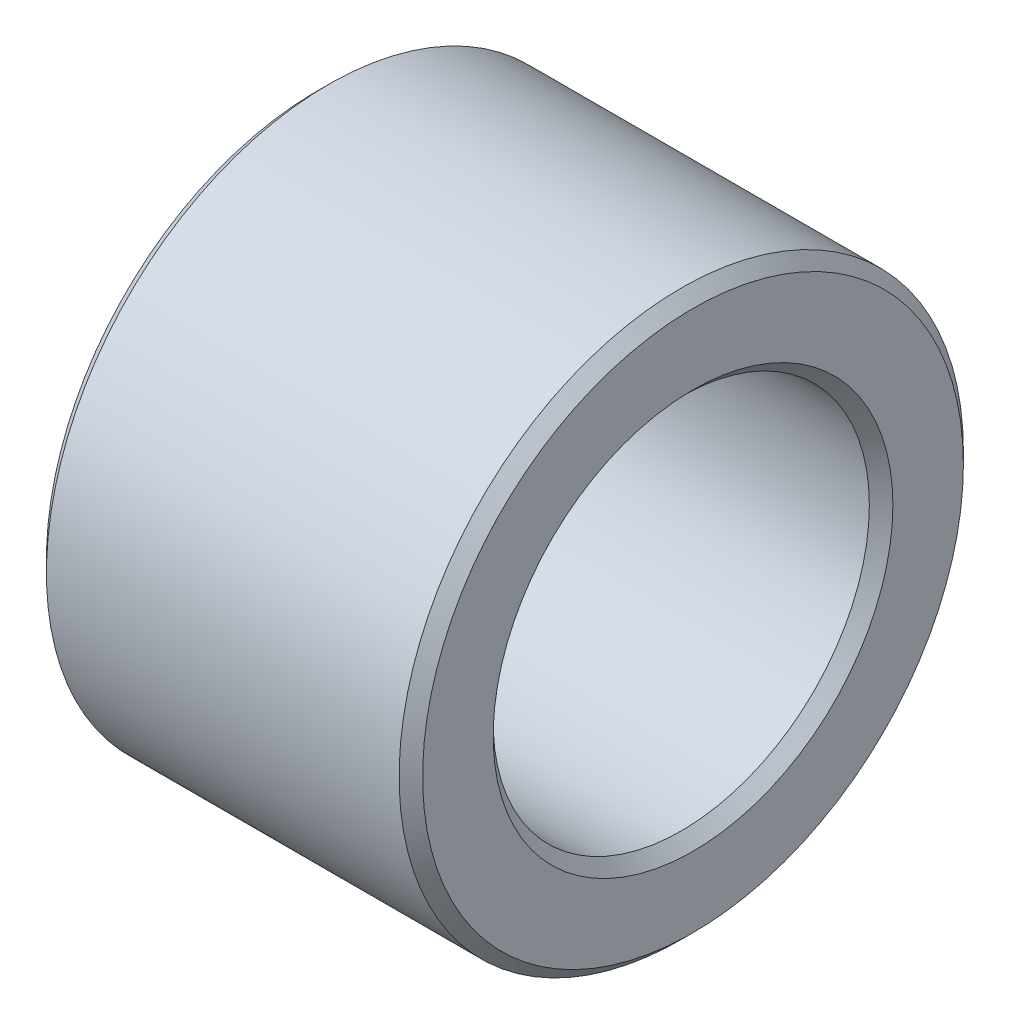
ISO-10303-21;
HEADER;
FILE_DESCRIPTION(('STEP AP214'),'2;1');
FILE_NAME('part.step','',(''),(''),'','','');
FILE_SCHEMA(('AUTOMOTIVE_DESIGN { 1 0 10303 214 1 1 1 1 }'));
ENDSEC;
DATA;
#1=APPLICATION_CONTEXT('core data for automotive mechanical design processes');
#2=APPLICATION_PROTOCOL_DEFINITION('international standard','automotive_design',2000,#1);
#3=PRODUCT_CONTEXT('',#1,'mechanical');
#4=PRODUCT('Part','Part','',(#3));
#5=PRODUCT_RELATED_PRODUCT_CATEGORY('part','',(#4));
#6=PRODUCT_DEFINITION_FORMATION('','',#4);
#7=PRODUCT_DEFINITION_CONTEXT('part definition',#1,'design');
#8=PRODUCT_DEFINITION('design','',#6,#7);
#9=PRODUCT_DEFINITION_SHAPE('','',#8);
#10=(LENGTH_UNIT() NAMED_UNIT(*) SI_UNIT(.MILLI.,.METRE.));
#11=(NAMED_UNIT(*) PLANE_ANGLE_UNIT() SI_UNIT($,.RADIAN.));
#12=(NAMED_UNIT(*) SI_UNIT($,.STERADIAN.) SOLID_ANGLE_UNIT());
#13=UNCERTAINTY_MEASURE_WITH_UNIT(LENGTH_MEASURE(1.E-05),#10,'distance_accuracy_value','');
#14=(GEOMETRIC_REPRESENTATION_CONTEXT(3) GLOBAL_UNCERTAINTY_ASSIGNED_CONTEXT((#13)) GLOBAL_UNIT_ASSIGNED_CONTEXT((#10,
#11,#12)) REPRESENTATION_CONTEXT('',''));
#15=CARTESIAN_POINT('',(0.,0.,0.));
#16=DIRECTION('',(0.,0.,1.));
#17=DIRECTION('',(1.,0.,0.));
#18=AXIS2_PLACEMENT_3D('',#15,#16,#17);
#19=CARTESIAN_POINT('',(8.,0.,0.));
#20=DIRECTION('',(1.,0.,0.));
#21=DIRECTION('',(0.,0.,-1.));
#22=AXIS2_PLACEMENT_3D('',#19,#20,#21);
#23=PLANE('',#22);
#24=CARTESIAN_POINT('',(8.,0.,0.));
#25=DIRECTION('',(1.,0.,0.));
#26=DIRECTION('',(0.,0.,-1.));
#27=AXIS2_PLACEMENT_3D('',#24,#25,#26);
#28=CIRCLE('',#27,5.75);
#29=CARTESIAN_POINT('',(8.,0.,-5.75));
#30=VERTEX_POINT('',#29);
#31=EDGE_CURVE('E10',#30,#30,#28,.T.);
#32=ORIENTED_EDGE('',*,*,#31,.T.);
#33=EDGE_LOOP('',(#32));
#34=FACE_BOUND('',#33,.T.);
#35=CARTESIAN_POINT('',(8.,0.,0.));
#36=DIRECTION('',(1.,0.,0.));
#37=DIRECTION('',(0.,0.,-1.));
#38=AXIS2_PLACEMENT_3D('',#35,#36,#37);
#39=CIRCLE('',#38,4.25);
#40=CARTESIAN_POINT('',(8.,0.,-4.25));
#41=VERTEX_POINT('',#40);
#42=EDGE_CURVE('E35',#41,#41,#39,.F.);
#43=ORIENTED_EDGE('',*,*,#42,.T.);
#44=EDGE_LOOP('',(#43));
#45=FACE_BOUND('',#44,.T.);
#46=ADVANCED_FACE('F28',(#34,#45),#23,.T.);
#47=CARTESIAN_POINT('',(0.,0.,0.));
#48=DIRECTION('',(1.,0.,0.));
#49=DIRECTION('',(0.,0.,-1.));
#50=AXIS2_PLACEMENT_3D('',#47,#48,#49);
#51=PLANE('',#50);
#52=CARTESIAN_POINT('',(0.,0.,0.));
#53=DIRECTION('',(1.,0.,0.));
#54=DIRECTION('',(0.,0.,-1.));
#55=AXIS2_PLACEMENT_3D('',#52,#53,#54);
#56=CIRCLE('',#55,5.75);
#57=CARTESIAN_POINT('',(0.,0.,-5.75));
#58=VERTEX_POINT('',#57);
#59=EDGE_CURVE('E48',#58,#58,#56,.F.);
#60=ORIENTED_EDGE('',*,*,#59,.T.);
#61=EDGE_LOOP('',(#60));
#62=FACE_BOUND('',#61,.T.);
#63=CARTESIAN_POINT('',(0.,0.,0.));
#64=DIRECTION('',(1.,0.,0.));
#65=DIRECTION('',(0.,0.,-1.));
#66=AXIS2_PLACEMENT_3D('',#63,#64,#65);
#67=CIRCLE('',#66,4.25);
#68=CARTESIAN_POINT('',(0.,0.,-4.25));
#69=VERTEX_POINT('',#68);
#70=EDGE_CURVE('E51',#69,#69,#67,.T.);
#71=ORIENTED_EDGE('',*,*,#70,.T.);
#72=EDGE_LOOP('',(#71));
#73=FACE_BOUND('',#72,.T.);
#74=ADVANCED_FACE('F76',(#62,#73),#51,.F.);
#75=CARTESIAN_POINT('',(8.,0.,0.));
#76=DIRECTION('',(-1.,0.,0.));
#77=DIRECTION('',(0.,0.,1.));
#78=AXIS2_PLACEMENT_3D('',#75,#76,#77);
#79=CYLINDRICAL_SURFACE('',#78,6.);
#80=CARTESIAN_POINT('',(0.250000000000001,0.,0.));
#81=DIRECTION('',(1.,0.,0.));
#82=DIRECTION('',(0.,0.,-1.));
#83=AXIS2_PLACEMENT_3D('',#80,#81,#82);
#84=CIRCLE('',#83,6.);
#85=CARTESIAN_POINT('',(0.250000000000001,0.,-6.));
#86=VERTEX_POINT('',#85);
#87=EDGE_CURVE('E54',#86,#86,#84,.T.);
#88=ORIENTED_EDGE('',*,*,#87,.T.);
#89=EDGE_LOOP('',(#88));
#90=FACE_BOUND('',#89,.T.);
#91=CARTESIAN_POINT('',(7.75,0.,0.));
#92=DIRECTION('',(1.,0.,0.));
#93=DIRECTION('',(0.,0.,-1.));
#94=AXIS2_PLACEMENT_3D('',#91,#92,#93);
#95=CIRCLE('',#94,6.);
#96=CARTESIAN_POINT('',(7.75,0.,-6.));
#97=VERTEX_POINT('',#96);
#98=EDGE_CURVE('E57',#97,#97,#95,.F.);
#99=ORIENTED_EDGE('',*,*,#98,.T.);
#100=EDGE_LOOP('',(#99));
#101=FACE_BOUND('',#100,.T.);
#102=ADVANCED_FACE('F61',(#90,#101),#79,.T.);
#103=CARTESIAN_POINT('',(8.,0.,0.));
#104=DIRECTION('',(-1.,0.,0.));
#105=DIRECTION('',(0.,0.,1.));
#106=AXIS2_PLACEMENT_3D('',#103,#104,#105);
#107=CYLINDRICAL_SURFACE('',#106,4.);
#108=CARTESIAN_POINT('',(0.250000000000002,0.,0.));
#109=DIRECTION('',(1.,0.,0.));
#110=DIRECTION('',(0.,0.,-1.));
#111=AXIS2_PLACEMENT_3D('',#108,#109,#110);
#112=CIRCLE('',#111,4.);
#113=CARTESIAN_POINT('',(0.250000000000002,0.,-4.));
#114=VERTEX_POINT('',#113);
#115=EDGE_CURVE('E39',#114,#114,#112,.F.);
#116=ORIENTED_EDGE('',*,*,#115,.T.);
#117=EDGE_LOOP('',(#116));
#118=FACE_BOUND('',#117,.T.);
#119=CARTESIAN_POINT('',(7.75,0.,0.));
#120=DIRECTION('',(1.,0.,0.));
#121=DIRECTION('',(0.,0.,-1.));
#122=AXIS2_PLACEMENT_3D('',#119,#120,#121);
#123=CIRCLE('',#122,4.);
#124=CARTESIAN_POINT('',(7.75,0.,-4.));
#125=VERTEX_POINT('',#124);
#126=EDGE_CURVE('E43',#125,#125,#123,.T.);
#127=ORIENTED_EDGE('',*,*,#126,.T.);
#128=EDGE_LOOP('',(#127));
#129=FACE_BOUND('',#128,.T.);
#130=ADVANCED_FACE('F84',(#118,#129),#107,.F.);
#131=CARTESIAN_POINT('',(0.250000000000001,0.,0.));
#132=DIRECTION('',(1.,0.,0.));
#133=DIRECTION('',(0.,0.,-1.));
#134=AXIS2_PLACEMENT_3D('',#131,#132,#133);
#135=CONICAL_SURFACE('',#134,6.,0.785398163397447);
#136=ORIENTED_EDGE('',*,*,#59,.F.);
#137=EDGE_LOOP('',(#136));
#138=FACE_BOUND('',#137,.T.);
#139=ORIENTED_EDGE('',*,*,#87,.F.);
#140=EDGE_LOOP('',(#139));
#141=FACE_BOUND('',#140,.T.);
#142=ADVANCED_FACE('F72',(#138,#141),#135,.T.);
#143=CARTESIAN_POINT('',(0.,0.,0.));
#144=DIRECTION('',(-1.,0.,0.));
#145=DIRECTION('',(0.,0.,1.));
#146=AXIS2_PLACEMENT_3D('',#143,#144,#145);
#147=CONICAL_SURFACE('',#146,4.25,0.785398163397445);
#148=ORIENTED_EDGE('',*,*,#115,.F.);
#149=EDGE_LOOP('',(#148));
#150=FACE_BOUND('',#149,.T.);
#151=ORIENTED_EDGE('',*,*,#70,.F.);
#152=EDGE_LOOP('',(#151));
#153=FACE_BOUND('',#152,.T.);
#154=ADVANCED_FACE('F66',(#150,#153),#147,.F.);
#155=CARTESIAN_POINT('',(8.,0.,0.));
#156=DIRECTION('',(-1.,0.,0.));
#157=DIRECTION('',(0.,0.,1.));
#158=AXIS2_PLACEMENT_3D('',#155,#156,#157);
#159=CONICAL_SURFACE('',#158,5.75,0.785398163397447);
#160=ORIENTED_EDGE('',*,*,#98,.F.);
#161=EDGE_LOOP('',(#160));
#162=FACE_BOUND('',#161,.T.);
#163=ORIENTED_EDGE('',*,*,#31,.F.);
#164=EDGE_LOOP('',(#163));
#165=FACE_BOUND('',#164,.T.);
#166=ADVANCED_FACE('F63',(#162,#165),#159,.T.);
#167=CARTESIAN_POINT('',(7.75,0.,0.));
#168=DIRECTION('',(1.,0.,0.));
#169=DIRECTION('',(0.,0.,-1.));
#170=AXIS2_PLACEMENT_3D('',#167,#168,#169);
#171=CONICAL_SURFACE('',#170,4.,0.785398163397452);
#172=ORIENTED_EDGE('',*,*,#42,.F.);
#173=EDGE_LOOP('',(#172));
#174=FACE_BOUND('',#173,.T.);
#175=ORIENTED_EDGE('',*,*,#126,.F.);
#176=EDGE_LOOP('',(#175));
#177=FACE_BOUND('',#176,.T.);
#178=ADVANCED_FACE('F30',(#174,#177),#171,.F.);
#179=CLOSED_SHELL('',(#46,#74,#102,#130,#142,#154,#166,#178));
#180=MANIFOLD_SOLID_BREP('B2',#179);
#181=ADVANCED_BREP_SHAPE_REPRESENTATION('',(#18,#180),#14);
#182=SHAPE_DEFINITION_REPRESENTATION(#9,#181);
ENDSEC;
END-ISO-10303-21;
